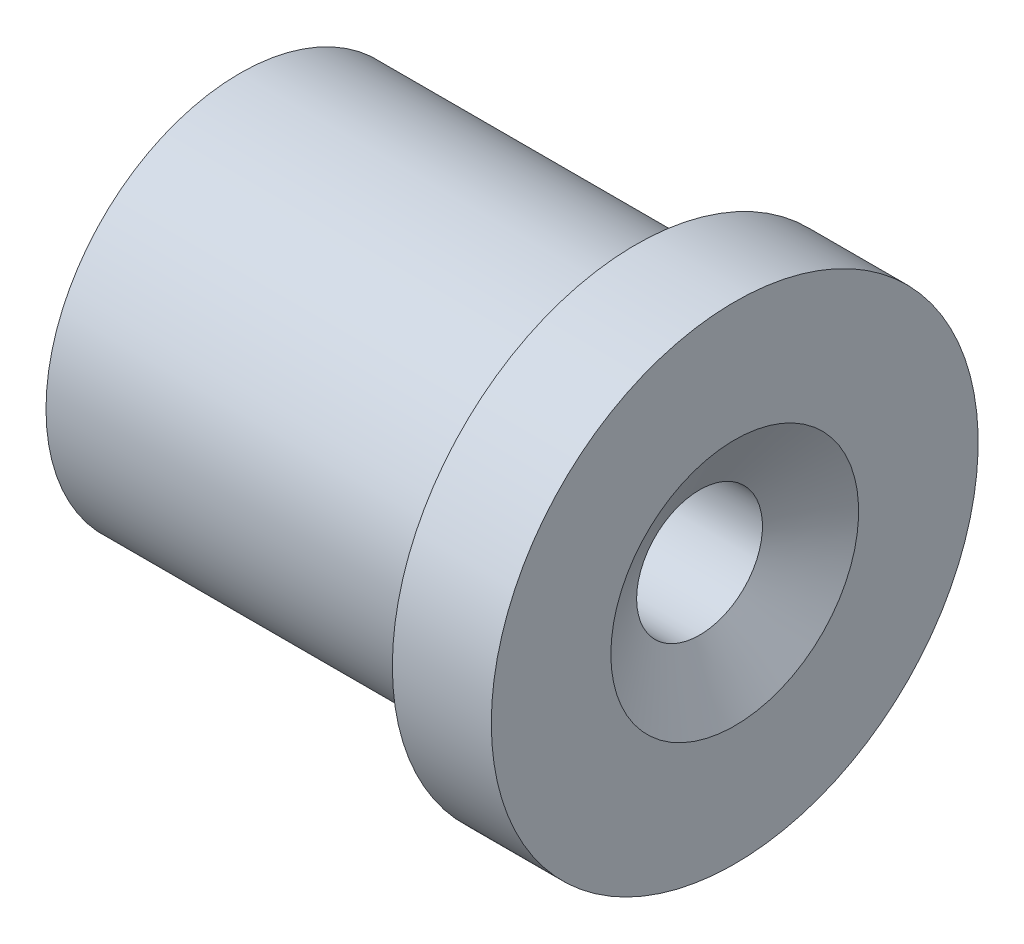
ISO-10303-21;
HEADER;
FILE_DESCRIPTION(('STEP AP214'),'2;1');
FILE_NAME('part.step','',(''),(''),'','','');
FILE_SCHEMA(('AUTOMOTIVE_DESIGN { 1 0 10303 214 1 1 1 1 }'));
ENDSEC;
DATA;
#1=APPLICATION_CONTEXT('core data for automotive mechanical design processes');
#2=APPLICATION_PROTOCOL_DEFINITION('international standard','automotive_design',2000,#1);
#3=PRODUCT_CONTEXT('',#1,'mechanical');
#4=PRODUCT('Part','Part','',(#3));
#5=PRODUCT_RELATED_PRODUCT_CATEGORY('part','',(#4));
#6=PRODUCT_DEFINITION_FORMATION('','',#4);
#7=PRODUCT_DEFINITION_CONTEXT('part definition',#1,'design');
#8=PRODUCT_DEFINITION('design','',#6,#7);
#9=PRODUCT_DEFINITION_SHAPE('','',#8);
#10=(LENGTH_UNIT() NAMED_UNIT(*) SI_UNIT(.MILLI.,.METRE.));
#11=(NAMED_UNIT(*) PLANE_ANGLE_UNIT() SI_UNIT($,.RADIAN.));
#12=(NAMED_UNIT(*) SI_UNIT($,.STERADIAN.) SOLID_ANGLE_UNIT());
#13=UNCERTAINTY_MEASURE_WITH_UNIT(LENGTH_MEASURE(1.E-05),#10,'distance_accuracy_value','');
#14=(GEOMETRIC_REPRESENTATION_CONTEXT(3) GLOBAL_UNCERTAINTY_ASSIGNED_CONTEXT((#13)) GLOBAL_UNIT_ASSIGNED_CONTEXT((#10,
#11,#12)) REPRESENTATION_CONTEXT('',''));
#15=CARTESIAN_POINT('',(0.,0.,0.));
#16=DIRECTION('',(0.,0.,1.));
#17=DIRECTION('',(1.,0.,0.));
#18=AXIS2_PLACEMENT_3D('',#15,#16,#17);
#19=CARTESIAN_POINT('',(-1.12918165648106,0.,0.));
#20=DIRECTION('',(1.,0.,0.));
#21=DIRECTION('',(0.,0.,-1.));
#22=AXIS2_PLACEMENT_3D('',#19,#20,#21);
#23=CONICAL_SURFACE('',#22,2.0193,1.0471975511966);
#24=CARTESIAN_POINT('',(0.,0.,0.));
#25=DIRECTION('',(-1.,0.,0.));
#26=DIRECTION('',(0.,0.,1.));
#27=AXIS2_PLACEMENT_3D('',#24,#25,#26);
#28=CIRCLE('',#27,3.9751);
#29=CARTESIAN_POINT('',(0.,0.,3.9751));
#30=VERTEX_POINT('',#29);
#31=EDGE_CURVE('E64',#30,#30,#28,.T.);
#32=ORIENTED_EDGE('',*,*,#31,.F.);
#33=EDGE_LOOP('',(#32));
#34=FACE_BOUND('',#33,.T.);
#35=CARTESIAN_POINT('',(-1.12918165648106,0.,0.));
#36=DIRECTION('',(-1.,0.,0.));
#37=DIRECTION('',(0.,0.,1.));
#38=AXIS2_PLACEMENT_3D('',#35,#36,#37);
#39=CIRCLE('',#38,2.0193);
#40=CARTESIAN_POINT('',(-1.12918165648106,0.,2.0193));
#41=VERTEX_POINT('',#40);
#42=EDGE_CURVE('E10',#41,#41,#39,.T.);
#43=ORIENTED_EDGE('',*,*,#42,.T.);
#44=EDGE_LOOP('',(#43));
#45=FACE_BOUND('',#44,.T.);
#46=ADVANCED_FACE('F30',(#34,#45),#23,.F.);
#47=CARTESIAN_POINT('',(16.5962548309153,0.,0.));
#48=DIRECTION('',(-1.,0.,0.));
#49=DIRECTION('',(0.,0.,1.));
#50=AXIS2_PLACEMENT_3D('',#47,#48,#49);
#51=CYLINDRICAL_SURFACE('',#50,2.0193);
#52=ORIENTED_EDGE('',*,*,#42,.F.);
#53=EDGE_LOOP('',(#52));
#54=FACE_BOUND('',#53,.T.);
#55=CARTESIAN_POINT('',(-5.86890372356346,0.,0.));
#56=DIRECTION('',(-1.,0.,0.));
#57=DIRECTION('',(0.,0.,1.));
#58=AXIS2_PLACEMENT_3D('',#55,#56,#57);
#59=CIRCLE('',#58,2.0193);
#60=CARTESIAN_POINT('',(-5.86890372356346,0.,2.0193));
#61=VERTEX_POINT('',#60);
#62=EDGE_CURVE('E36',#61,#61,#59,.T.);
#63=ORIENTED_EDGE('',*,*,#62,.T.);
#64=EDGE_LOOP('',(#63));
#65=FACE_BOUND('',#64,.T.);
#66=ADVANCED_FACE('F71',(#54,#65),#51,.F.);
#67=CARTESIAN_POINT('',(-7.1374,0.,0.));
#68=DIRECTION('',(-1.,0.,0.));
#69=DIRECTION('',(0.,0.,1.));
#70=AXIS2_PLACEMENT_3D('',#67,#68,#69);
#71=CONICAL_SURFACE('',#70,4.2164,1.04719755119659);
#72=ORIENTED_EDGE('',*,*,#62,.F.);
#73=EDGE_LOOP('',(#72));
#74=FACE_BOUND('',#73,.T.);
#75=CARTESIAN_POINT('',(-7.1374,0.,0.));
#76=DIRECTION('',(-1.,0.,0.));
#77=DIRECTION('',(0.,0.,1.));
#78=AXIS2_PLACEMENT_3D('',#75,#76,#77);
#79=CIRCLE('',#78,4.2164);
#80=CARTESIAN_POINT('',(-7.1374,0.,4.2164));
#81=VERTEX_POINT('',#80);
#82=EDGE_CURVE('E40',#81,#81,#79,.T.);
#83=ORIENTED_EDGE('',*,*,#82,.T.);
#84=EDGE_LOOP('',(#83));
#85=FACE_BOUND('',#84,.T.);
#86=ADVANCED_FACE('F75',(#74,#85),#71,.F.);
#87=CARTESIAN_POINT('',(16.5962548309153,0.,0.));
#88=DIRECTION('',(-1.,0.,0.));
#89=DIRECTION('',(0.,0.,1.));
#90=AXIS2_PLACEMENT_3D('',#87,#88,#89);
#91=CYLINDRICAL_SURFACE('',#90,4.2164);
#92=ORIENTED_EDGE('',*,*,#82,.F.);
#93=EDGE_LOOP('',(#92));
#94=FACE_BOUND('',#93,.T.);
#95=CARTESIAN_POINT('',(-15.5194,0.,0.));
#96=DIRECTION('',(-1.,0.,0.));
#97=DIRECTION('',(0.,0.,1.));
#98=AXIS2_PLACEMENT_3D('',#95,#96,#97);
#99=CIRCLE('',#98,4.2164);
#100=CARTESIAN_POINT('',(-15.5194,0.,4.2164));
#101=VERTEX_POINT('',#100);
#102=EDGE_CURVE('E44',#101,#101,#99,.T.);
#103=ORIENTED_EDGE('',*,*,#102,.T.);
#104=EDGE_LOOP('',(#103));
#105=FACE_BOUND('',#104,.T.);
#106=ADVANCED_FACE('F80',(#94,#105),#91,.F.);
#107=CARTESIAN_POINT('',(-15.875,0.,0.));
#108=DIRECTION('',(-1.,0.,0.));
#109=DIRECTION('',(0.,0.,1.));
#110=AXIS2_PLACEMENT_3D('',#107,#108,#109);
#111=CONICAL_SURFACE('',#110,4.572,0.785398163397452);
#112=ORIENTED_EDGE('',*,*,#102,.F.);
#113=EDGE_LOOP('',(#112));
#114=FACE_BOUND('',#113,.T.);
#115=CARTESIAN_POINT('',(-15.875,0.,0.));
#116=DIRECTION('',(-1.,0.,0.));
#117=DIRECTION('',(0.,0.,1.));
#118=AXIS2_PLACEMENT_3D('',#115,#116,#117);
#119=CIRCLE('',#118,4.572);
#120=CARTESIAN_POINT('',(-15.875,0.,4.572));
#121=VERTEX_POINT('',#120);
#122=EDGE_CURVE('E49',#121,#121,#119,.T.);
#123=ORIENTED_EDGE('',*,*,#122,.T.);
#124=EDGE_LOOP('',(#123));
#125=FACE_BOUND('',#124,.T.);
#126=ADVANCED_FACE('F86',(#114,#125),#111,.F.);
#127=CARTESIAN_POINT('',(-15.875,6.223,0.));
#128=DIRECTION('',(1.,0.,0.));
#129=DIRECTION('',(0.,0.,-1.));
#130=AXIS2_PLACEMENT_3D('',#127,#128,#129);
#131=PLANE('',#130);
#132=ORIENTED_EDGE('',*,*,#122,.F.);
#133=EDGE_LOOP('',(#132));
#134=FACE_BOUND('',#133,.T.);
#135=CARTESIAN_POINT('',(-15.875,0.,0.));
#136=DIRECTION('',(-1.,0.,0.));
#137=DIRECTION('',(0.,0.,1.));
#138=AXIS2_PLACEMENT_3D('',#135,#136,#137);
#139=CIRCLE('',#138,6.223);
#140=CARTESIAN_POINT('',(-15.875,0.,6.223));
#141=VERTEX_POINT('',#140);
#142=EDGE_CURVE('E52',#141,#141,#139,.T.);
#143=ORIENTED_EDGE('',*,*,#142,.T.);
#144=EDGE_LOOP('',(#143));
#145=FACE_BOUND('',#144,.T.);
#146=ADVANCED_FACE('F90',(#134,#145),#131,.F.);
#147=CARTESIAN_POINT('',(16.5962548309153,0.,0.));
#148=DIRECTION('',(-1.,0.,0.));
#149=DIRECTION('',(0.,0.,1.));
#150=AXIS2_PLACEMENT_3D('',#147,#148,#149);
#151=CYLINDRICAL_SURFACE('',#150,6.223);
#152=ORIENTED_EDGE('',*,*,#142,.F.);
#153=EDGE_LOOP('',(#152));
#154=FACE_BOUND('',#153,.T.);
#155=CARTESIAN_POINT('',(-3.175,0.,0.));
#156=DIRECTION('',(-1.,0.,0.));
#157=DIRECTION('',(0.,0.,1.));
#158=AXIS2_PLACEMENT_3D('',#155,#156,#157);
#159=CIRCLE('',#158,6.223);
#160=CARTESIAN_POINT('',(-3.175,0.,6.223));
#161=VERTEX_POINT('',#160);
#162=EDGE_CURVE('E55',#161,#161,#159,.T.);
#163=ORIENTED_EDGE('',*,*,#162,.T.);
#164=EDGE_LOOP('',(#163));
#165=FACE_BOUND('',#164,.T.);
#166=ADVANCED_FACE('F94',(#154,#165),#151,.T.);
#167=CARTESIAN_POINT('',(-3.175,6.223,0.));
#168=DIRECTION('',(1.,0.,0.));
#169=DIRECTION('',(0.,0.,-1.));
#170=AXIS2_PLACEMENT_3D('',#167,#168,#169);
#171=PLANE('',#170);
#172=ORIENTED_EDGE('',*,*,#162,.F.);
#173=EDGE_LOOP('',(#172));
#174=FACE_BOUND('',#173,.T.);
#175=CARTESIAN_POINT('',(-3.175,0.,0.));
#176=DIRECTION('',(-1.,0.,0.));
#177=DIRECTION('',(0.,0.,1.));
#178=AXIS2_PLACEMENT_3D('',#175,#176,#177);
#179=CIRCLE('',#178,7.8105);
#180=CARTESIAN_POINT('',(-3.175,0.,7.8105));
#181=VERTEX_POINT('',#180);
#182=EDGE_CURVE('E58',#181,#181,#179,.T.);
#183=ORIENTED_EDGE('',*,*,#182,.T.);
#184=EDGE_LOOP('',(#183));
#185=FACE_BOUND('',#184,.T.);
#186=ADVANCED_FACE('F98',(#174,#185),#171,.F.);
#187=CARTESIAN_POINT('',(16.5962548309153,0.,0.));
#188=DIRECTION('',(-1.,0.,0.));
#189=DIRECTION('',(0.,0.,1.));
#190=AXIS2_PLACEMENT_3D('',#187,#188,#189);
#191=CYLINDRICAL_SURFACE('',#190,7.8105);
#192=ORIENTED_EDGE('',*,*,#182,.F.);
#193=EDGE_LOOP('',(#192));
#194=FACE_BOUND('',#193,.T.);
#195=CARTESIAN_POINT('',(0.,0.,0.));
#196=DIRECTION('',(-1.,0.,0.));
#197=DIRECTION('',(0.,0.,1.));
#198=AXIS2_PLACEMENT_3D('',#195,#196,#197);
#199=CIRCLE('',#198,7.8105);
#200=CARTESIAN_POINT('',(0.,0.,7.8105));
#201=VERTEX_POINT('',#200);
#202=EDGE_CURVE('E61',#201,#201,#199,.T.);
#203=ORIENTED_EDGE('',*,*,#202,.T.);
#204=EDGE_LOOP('',(#203));
#205=FACE_BOUND('',#204,.T.);
#206=ADVANCED_FACE('F102',(#194,#205),#191,.T.);
#207=CARTESIAN_POINT('',(0.,3.9751,0.));
#208=DIRECTION('',(-1.,0.,0.));
#209=DIRECTION('',(0.,0.,1.));
#210=AXIS2_PLACEMENT_3D('',#207,#208,#209);
#211=PLANE('',#210);
#212=ORIENTED_EDGE('',*,*,#202,.F.);
#213=EDGE_LOOP('',(#212));
#214=FACE_BOUND('',#213,.T.);
#215=ORIENTED_EDGE('',*,*,#31,.T.);
#216=EDGE_LOOP('',(#215));
#217=FACE_BOUND('',#216,.T.);
#218=ADVANCED_FACE('F68',(#214,#217),#211,.F.);
#219=CLOSED_SHELL('',(#46,#66,#86,#106,#126,#146,#166,#186,#206,#218));
#220=MANIFOLD_SOLID_BREP('B2',#219);
#221=ADVANCED_BREP_SHAPE_REPRESENTATION('',(#18,#220),#14);
#222=SHAPE_DEFINITION_REPRESENTATION(#9,#221);
ENDSEC;
END-ISO-10303-21;
